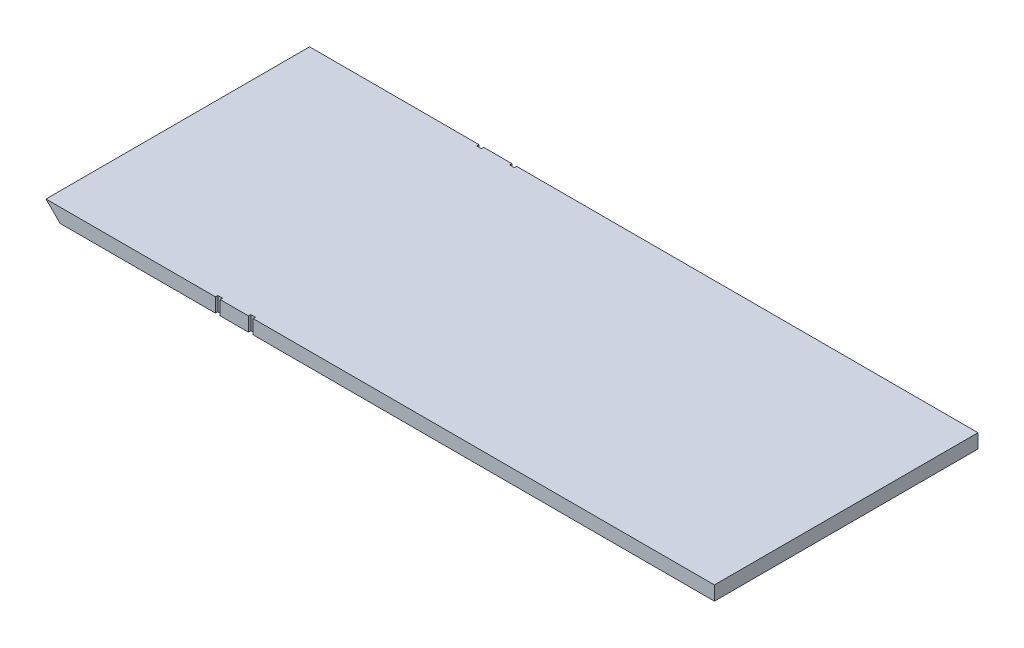
ISO-10303-21;
HEADER;
FILE_DESCRIPTION(('STEP AP214'),'2;1');
FILE_NAME('part.step','',(''),(''),'','','');
FILE_SCHEMA(('AUTOMOTIVE_DESIGN { 1 0 10303 214 1 1 1 1 }'));
ENDSEC;
DATA;
#1=APPLICATION_CONTEXT('core data for automotive mechanical design processes');
#2=APPLICATION_PROTOCOL_DEFINITION('international standard','automotive_design',2000,#1);
#3=PRODUCT_CONTEXT('',#1,'mechanical');
#4=PRODUCT('Part','Part','',(#3));
#5=PRODUCT_RELATED_PRODUCT_CATEGORY('part','',(#4));
#6=PRODUCT_DEFINITION_FORMATION('','',#4);
#7=PRODUCT_DEFINITION_CONTEXT('part definition',#1,'design');
#8=PRODUCT_DEFINITION('design','',#6,#7);
#9=PRODUCT_DEFINITION_SHAPE('','',#8);
#10=(LENGTH_UNIT() NAMED_UNIT(*) SI_UNIT(.MILLI.,.METRE.));
#11=(NAMED_UNIT(*) PLANE_ANGLE_UNIT() SI_UNIT($,.RADIAN.));
#12=(NAMED_UNIT(*) SI_UNIT($,.STERADIAN.) SOLID_ANGLE_UNIT());
#13=UNCERTAINTY_MEASURE_WITH_UNIT(LENGTH_MEASURE(1.E-05),#10,'distance_accuracy_value','');
#14=(GEOMETRIC_REPRESENTATION_CONTEXT(3) GLOBAL_UNCERTAINTY_ASSIGNED_CONTEXT((#13)) GLOBAL_UNIT_ASSIGNED_CONTEXT((#10,
#11,#12)) REPRESENTATION_CONTEXT('',''));
#15=CARTESIAN_POINT('',(0.,0.,0.));
#16=DIRECTION('',(0.,0.,1.));
#17=DIRECTION('',(1.,0.,0.));
#18=AXIS2_PLACEMENT_3D('',#15,#16,#17);
#19=CARTESIAN_POINT('',(-450.85,9.525,-177.8));
#20=DIRECTION('',(0.,0.,1.));
#21=DIRECTION('',(1.,0.,0.));
#22=AXIS2_PLACEMENT_3D('',#19,#20,#21);
#23=PLANE('',#22);
#24=DIRECTION('',(-1.,0.,0.));
#25=VECTOR('',#24,1.);
#26=CARTESIAN_POINT('',(-450.85,9.525,-177.8));
#27=LINE('',#26,#25);
#28=CARTESIAN_POINT('',(-222.249999999984,9.52499999998907,-177.8));
#29=VERTEX_POINT('',#28);
#30=CARTESIAN_POINT('',(-450.85,9.525,-177.8));
#31=VERTEX_POINT('',#30);
#32=EDGE_CURVE('E280',#29,#31,#27,.T.);
#33=ORIENTED_EDGE('',*,*,#32,.F.);
#34=DIRECTION('',(0.,1.,0.));
#35=VECTOR('',#34,1.);
#36=CARTESIAN_POINT('',(-222.249999999984,-9.525,-177.8));
#37=LINE('',#36,#35);
#38=CARTESIAN_POINT('',(-222.249999999984,-9.525,-177.8));
#39=VERTEX_POINT('',#38);
#40=EDGE_CURVE('E175',#39,#29,#37,.T.);
#41=ORIENTED_EDGE('',*,*,#40,.F.);
#42=DIRECTION('',(-1.,0.,0.));
#43=VECTOR('',#42,1.);
#44=CARTESIAN_POINT('',(-450.85,-9.525,-177.8));
#45=LINE('',#44,#43);
#46=CARTESIAN_POINT('',(-431.8,-9.525,-177.8));
#47=VERTEX_POINT('',#46);
#48=EDGE_CURVE('E297',#39,#47,#45,.T.);
#49=ORIENTED_EDGE('',*,*,#48,.T.);
#50=DIRECTION('',(0.70710678118655,-0.707106781186545,0.));
#51=VECTOR('',#50,1.);
#52=CARTESIAN_POINT('',(-450.85,9.52500000000012,-177.8));
#53=LINE('',#52,#51);
#54=EDGE_CURVE('E11',#47,#31,#53,.F.);
#55=ORIENTED_EDGE('',*,*,#54,.T.);
#56=EDGE_LOOP('',(#33,#41,#49,#55));
#57=FACE_BOUND('',#56,.T.);
#58=ADVANCED_FACE('F32',(#57),#23,.F.);
#59=CARTESIAN_POINT('',(-177.799999999984,-9.525,-177.8));
#60=VERTEX_POINT('',#59);
#61=CARTESIAN_POINT('',(-215.899999999984,-9.525,-177.8));
#62=VERTEX_POINT('',#61);
#63=EDGE_CURVE('E302',#60,#62,#45,.T.);
#64=ORIENTED_EDGE('',*,*,#63,.T.);
#65=DIRECTION('',(0.,-1.,0.));
#66=VECTOR('',#65,1.);
#67=CARTESIAN_POINT('',(-215.899999999984,-9.525,-177.8));
#68=LINE('',#67,#66);
#69=CARTESIAN_POINT('',(-215.899999999984,9.52499999998913,-177.8));
#70=VERTEX_POINT('',#69);
#71=EDGE_CURVE('E187',#70,#62,#68,.T.);
#72=ORIENTED_EDGE('',*,*,#71,.F.);
#73=CARTESIAN_POINT('',(-177.799999999984,9.52499999998935,-177.8));
#74=VERTEX_POINT('',#73);
#75=EDGE_CURVE('E286',#74,#70,#27,.T.);
#76=ORIENTED_EDGE('',*,*,#75,.F.);
#77=DIRECTION('',(0.,1.,0.));
#78=VECTOR('',#77,1.);
#79=CARTESIAN_POINT('',(-177.799999999984,9.52499999998935,-177.8));
#80=LINE('',#79,#78);
#81=EDGE_CURVE('E199',#60,#74,#80,.T.);
#82=ORIENTED_EDGE('',*,*,#81,.F.);
#83=EDGE_LOOP('',(#64,#72,#76,#82));
#84=FACE_BOUND('',#83,.T.);
#85=ADVANCED_FACE('F327',(#84),#23,.F.);
#86=CARTESIAN_POINT('',(-450.85,9.525,177.8));
#87=DIRECTION('',(0.,0.,-1.));
#88=DIRECTION('',(-1.,0.,0.));
#89=AXIS2_PLACEMENT_3D('',#86,#87,#88);
#90=PLANE('',#89);
#91=DIRECTION('',(1.,0.,0.));
#92=VECTOR('',#91,1.);
#93=CARTESIAN_POINT('',(-450.85,-9.525,177.8));
#94=LINE('',#93,#92);
#95=CARTESIAN_POINT('',(-431.8,-9.525,177.8));
#96=VERTEX_POINT('',#95);
#97=CARTESIAN_POINT('',(-222.25,-9.525,177.8));
#98=VERTEX_POINT('',#97);
#99=EDGE_CURVE('E281',#96,#98,#94,.T.);
#100=ORIENTED_EDGE('',*,*,#99,.T.);
#101=DIRECTION('',(0.,-1.,0.));
#102=VECTOR('',#101,1.);
#103=CARTESIAN_POINT('',(-222.25,9.52500000000428,177.8));
#104=LINE('',#103,#102);
#105=CARTESIAN_POINT('',(-222.25,9.52500000000428,177.8));
#106=VERTEX_POINT('',#105);
#107=EDGE_CURVE('E218',#106,#98,#104,.T.);
#108=ORIENTED_EDGE('',*,*,#107,.F.);
#109=DIRECTION('',(1.,0.,0.));
#110=VECTOR('',#109,1.);
#111=CARTESIAN_POINT('',(-450.85,9.525,177.8));
#112=LINE('',#111,#110);
#113=CARTESIAN_POINT('',(-450.85,9.525,177.8));
#114=VERTEX_POINT('',#113);
#115=EDGE_CURVE('E290',#114,#106,#112,.T.);
#116=ORIENTED_EDGE('',*,*,#115,.F.);
#117=DIRECTION('',(-0.70710678118655,0.707106781186545,0.));
#118=VECTOR('',#117,1.);
#119=CARTESIAN_POINT('',(-450.85,9.52500000000015,177.8));
#120=LINE('',#119,#118);
#121=EDGE_CURVE('E311',#114,#96,#120,.F.);
#122=ORIENTED_EDGE('',*,*,#121,.T.);
#123=EDGE_LOOP('',(#100,#108,#116,#122));
#124=FACE_BOUND('',#123,.T.);
#125=ADVANCED_FACE('F348',(#124),#90,.F.);
#126=CARTESIAN_POINT('',(-171.45,9.52500000000431,177.8));
#127=VERTEX_POINT('',#126);
#128=CARTESIAN_POINT('',(450.85,9.525,177.8));
#129=VERTEX_POINT('',#128);
#130=EDGE_CURVE('E289',#127,#129,#112,.T.);
#131=ORIENTED_EDGE('',*,*,#130,.F.);
#132=DIRECTION('',(0.,1.,0.));
#133=VECTOR('',#132,1.);
#134=CARTESIAN_POINT('',(-171.45,-9.525,177.8));
#135=LINE('',#134,#133);
#136=CARTESIAN_POINT('',(-171.45,-9.525,177.8));
#137=VERTEX_POINT('',#136);
#138=EDGE_CURVE('E255',#137,#127,#135,.T.);
#139=ORIENTED_EDGE('',*,*,#138,.F.);
#140=CARTESIAN_POINT('',(450.85,-9.525,177.8));
#141=VERTEX_POINT('',#140);
#142=EDGE_CURVE('E301',#137,#141,#94,.T.);
#143=ORIENTED_EDGE('',*,*,#142,.T.);
#144=DIRECTION('',(0.,-1.,0.));
#145=VECTOR('',#144,1.);
#146=CARTESIAN_POINT('',(450.85,9.525,177.8));
#147=LINE('',#146,#145);
#148=EDGE_CURVE('E293',#129,#141,#147,.T.);
#149=ORIENTED_EDGE('',*,*,#148,.F.);
#150=EDGE_LOOP('',(#131,#139,#143,#149));
#151=FACE_BOUND('',#150,.T.);
#152=ADVANCED_FACE('F359',(#151),#90,.F.);
#153=CARTESIAN_POINT('',(450.85,9.525,-177.8));
#154=DIRECTION('',(-1.,0.,0.));
#155=DIRECTION('',(0.,0.,1.));
#156=AXIS2_PLACEMENT_3D('',#153,#154,#155);
#157=PLANE('',#156);
#158=DIRECTION('',(0.,0.,-1.));
#159=VECTOR('',#158,1.);
#160=CARTESIAN_POINT('',(450.85,-9.525,-177.8));
#161=LINE('',#160,#159);
#162=CARTESIAN_POINT('',(450.85,-9.525,-177.8));
#163=VERTEX_POINT('',#162);
#164=EDGE_CURVE('E269',#141,#163,#161,.T.);
#165=ORIENTED_EDGE('',*,*,#164,.T.);
#166=DIRECTION('',(0.,-1.,0.));
#167=VECTOR('',#166,1.);
#168=CARTESIAN_POINT('',(450.85,9.525,-177.8));
#169=LINE('',#168,#167);
#170=CARTESIAN_POINT('',(450.85,9.525,-177.8));
#171=VERTEX_POINT('',#170);
#172=EDGE_CURVE('E308',#171,#163,#169,.T.);
#173=ORIENTED_EDGE('',*,*,#172,.F.);
#174=DIRECTION('',(0.,0.,-1.));
#175=VECTOR('',#174,1.);
#176=CARTESIAN_POINT('',(450.85,9.525,-177.8));
#177=LINE('',#176,#175);
#178=EDGE_CURVE('E277',#129,#171,#177,.T.);
#179=ORIENTED_EDGE('',*,*,#178,.F.);
#180=ORIENTED_EDGE('',*,*,#148,.T.);
#181=EDGE_LOOP('',(#165,#173,#179,#180));
#182=FACE_BOUND('',#181,.T.);
#183=ADVANCED_FACE('F352',(#182),#157,.F.);
#184=CARTESIAN_POINT('',(-171.449999999984,-9.525,-177.8));
#185=VERTEX_POINT('',#184);
#186=EDGE_CURVE('E298',#163,#185,#45,.T.);
#187=ORIENTED_EDGE('',*,*,#186,.T.);
#188=DIRECTION('',(0.,-1.,0.));
#189=VECTOR('',#188,1.);
#190=CARTESIAN_POINT('',(-171.449999999984,9.52499999998938,-177.8));
#191=LINE('',#190,#189);
#192=CARTESIAN_POINT('',(-171.449999999984,9.52499999998938,-177.8));
#193=VERTEX_POINT('',#192);
#194=EDGE_CURVE('E208',#193,#185,#191,.T.);
#195=ORIENTED_EDGE('',*,*,#194,.F.);
#196=EDGE_CURVE('E282',#171,#193,#27,.T.);
#197=ORIENTED_EDGE('',*,*,#196,.F.);
#198=ORIENTED_EDGE('',*,*,#172,.T.);
#199=EDGE_LOOP('',(#187,#195,#197,#198));
#200=FACE_BOUND('',#199,.T.);
#201=ADVANCED_FACE('F344',(#200),#23,.F.);
#202=CARTESIAN_POINT('',(-215.9,9.52500000000428,177.8));
#203=VERTEX_POINT('',#202);
#204=CARTESIAN_POINT('',(-177.8,9.52500000000431,177.8));
#205=VERTEX_POINT('',#204);
#206=EDGE_CURVE('E294',#203,#205,#112,.T.);
#207=ORIENTED_EDGE('',*,*,#206,.F.);
#208=DIRECTION('',(0.,1.,0.));
#209=VECTOR('',#208,1.);
#210=CARTESIAN_POINT('',(-215.9,9.52500000000428,177.8));
#211=LINE('',#210,#209);
#212=CARTESIAN_POINT('',(-215.9,-9.525,177.8));
#213=VERTEX_POINT('',#212);
#214=EDGE_CURVE('E229',#213,#203,#211,.T.);
#215=ORIENTED_EDGE('',*,*,#214,.F.);
#216=CARTESIAN_POINT('',(-177.8,-9.525,177.8));
#217=VERTEX_POINT('',#216);
#218=EDGE_CURVE('E305',#213,#217,#94,.T.);
#219=ORIENTED_EDGE('',*,*,#218,.T.);
#220=DIRECTION('',(0.,-1.,0.));
#221=VECTOR('',#220,1.);
#222=CARTESIAN_POINT('',(-177.8,-9.525,177.8));
#223=LINE('',#222,#221);
#224=EDGE_CURVE('E243',#205,#217,#223,.T.);
#225=ORIENTED_EDGE('',*,*,#224,.F.);
#226=EDGE_LOOP('',(#207,#215,#219,#225));
#227=FACE_BOUND('',#226,.T.);
#228=ADVANCED_FACE('F351',(#227),#90,.F.);
#229=CARTESIAN_POINT('',(0.,9.525,0.));
#230=DIRECTION('',(0.,1.,0.));
#231=DIRECTION('',(0.,0.,1.));
#232=AXIS2_PLACEMENT_3D('',#229,#230,#231);
#233=PLANE('',#232);
#234=DIRECTION('',(0.,0.,-1.));
#235=VECTOR('',#234,1.);
#236=CARTESIAN_POINT('',(-222.249999999984,9.52499999998907,-174.625));
#237=LINE('',#236,#235);
#238=CARTESIAN_POINT('',(-222.249999999984,9.52499999998907,-174.625));
#239=VERTEX_POINT('',#238);
#240=EDGE_CURVE('E170',#239,#29,#237,.T.);
#241=ORIENTED_EDGE('',*,*,#240,.T.);
#242=ORIENTED_EDGE('',*,*,#32,.T.);
#243=DIRECTION('',(0.,0.,1.));
#244=VECTOR('',#243,1.);
#245=CARTESIAN_POINT('',(-450.85,9.525,-177.8));
#246=LINE('',#245,#244);
#247=EDGE_CURVE('E285',#31,#114,#246,.T.);
#248=ORIENTED_EDGE('',*,*,#247,.T.);
#249=ORIENTED_EDGE('',*,*,#115,.T.);
#250=DIRECTION('',(0.,0.,1.));
#251=VECTOR('',#250,1.);
#252=CARTESIAN_POINT('',(-222.25,9.52500000000428,174.625));
#253=LINE('',#252,#251);
#254=CARTESIAN_POINT('',(-222.25,9.52500000000428,174.625));
#255=VERTEX_POINT('',#254);
#256=EDGE_CURVE('E241',#255,#106,#253,.T.);
#257=ORIENTED_EDGE('',*,*,#256,.F.);
#258=DIRECTION('',(-1.,0.,0.));
#259=VECTOR('',#258,1.);
#260=CARTESIAN_POINT('',(-222.25,9.52500000000428,174.625));
#261=LINE('',#260,#259);
#262=CARTESIAN_POINT('',(-215.9,9.52500000000428,174.625));
#263=VERTEX_POINT('',#262);
#264=EDGE_CURVE('E235',#263,#255,#261,.T.);
#265=ORIENTED_EDGE('',*,*,#264,.F.);
#266=DIRECTION('',(0.,0.,1.));
#267=VECTOR('',#266,1.);
#268=CARTESIAN_POINT('',(-215.9,9.52500000000428,174.625));
#269=LINE('',#268,#267);
#270=EDGE_CURVE('E244',#263,#203,#269,.T.);
#271=ORIENTED_EDGE('',*,*,#270,.T.);
#272=ORIENTED_EDGE('',*,*,#206,.T.);
#273=DIRECTION('',(0.,0.,1.));
#274=VECTOR('',#273,1.);
#275=CARTESIAN_POINT('',(-177.8,9.52500000000431,174.625));
#276=LINE('',#275,#274);
#277=CARTESIAN_POINT('',(-177.8,9.52500000000431,174.625));
#278=VERTEX_POINT('',#277);
#279=EDGE_CURVE('E262',#278,#205,#276,.T.);
#280=ORIENTED_EDGE('',*,*,#279,.F.);
#281=DIRECTION('',(-1.,0.,0.));
#282=VECTOR('',#281,1.);
#283=CARTESIAN_POINT('',(-177.8,9.52500000000431,174.625));
#284=LINE('',#283,#282);
#285=CARTESIAN_POINT('',(-171.45,9.52500000000431,174.625));
#286=VERTEX_POINT('',#285);
#287=EDGE_CURVE('E251',#286,#278,#284,.T.);
#288=ORIENTED_EDGE('',*,*,#287,.F.);
#289=DIRECTION('',(0.,0.,1.));
#290=VECTOR('',#289,1.);
#291=CARTESIAN_POINT('',(-171.45,9.52500000000431,174.625));
#292=LINE('',#291,#290);
#293=EDGE_CURVE('E266',#286,#127,#292,.T.);
#294=ORIENTED_EDGE('',*,*,#293,.T.);
#295=ORIENTED_EDGE('',*,*,#130,.T.);
#296=ORIENTED_EDGE('',*,*,#178,.T.);
#297=ORIENTED_EDGE('',*,*,#196,.T.);
#298=DIRECTION('',(0.,0.,-1.));
#299=VECTOR('',#298,1.);
#300=CARTESIAN_POINT('',(-171.449999999984,9.52499999998938,-174.625));
#301=LINE('',#300,#299);
#302=CARTESIAN_POINT('',(-171.449999999984,9.52499999998938,-174.625));
#303=VERTEX_POINT('',#302);
#304=EDGE_CURVE('E222',#303,#193,#301,.T.);
#305=ORIENTED_EDGE('',*,*,#304,.F.);
#306=DIRECTION('',(1.,0.,0.));
#307=VECTOR('',#306,1.);
#308=CARTESIAN_POINT('',(-177.799999999984,9.52499999998935,-174.625));
#309=LINE('',#308,#307);
#310=CARTESIAN_POINT('',(-177.799999999984,9.52499999998935,-174.625));
#311=VERTEX_POINT('',#310);
#312=EDGE_CURVE('E207',#311,#303,#309,.T.);
#313=ORIENTED_EDGE('',*,*,#312,.F.);
#314=DIRECTION('',(0.,0.,-1.));
#315=VECTOR('',#314,1.);
#316=CARTESIAN_POINT('',(-177.799999999984,9.52499999998935,-174.625));
#317=LINE('',#316,#315);
#318=EDGE_CURVE('E213',#311,#74,#317,.T.);
#319=ORIENTED_EDGE('',*,*,#318,.T.);
#320=ORIENTED_EDGE('',*,*,#75,.T.);
#321=DIRECTION('',(0.,0.,-1.));
#322=VECTOR('',#321,1.);
#323=CARTESIAN_POINT('',(-215.899999999984,9.52499999998913,-174.625));
#324=LINE('',#323,#322);
#325=CARTESIAN_POINT('',(-215.899999999984,9.52499999998913,-174.625));
#326=VERTEX_POINT('',#325);
#327=EDGE_CURVE('E179',#326,#70,#324,.T.);
#328=ORIENTED_EDGE('',*,*,#327,.F.);
#329=DIRECTION('',(1.,0.,0.));
#330=VECTOR('',#329,1.);
#331=CARTESIAN_POINT('',(-222.249999999984,9.52499999998907,-174.625));
#332=LINE('',#331,#330);
#333=EDGE_CURVE('E183',#239,#326,#332,.T.);
#334=ORIENTED_EDGE('',*,*,#333,.F.);
#335=EDGE_LOOP('',(#241,#242,#248,#249,#257,#265,#271,#272,#280,#288,#294,#295,#296,#297,#305,
#313,#319,#320,#328,#334));
#336=FACE_BOUND('',#335,.T.);
#337=ADVANCED_FACE('F189',(#336),#233,.T.);
#338=CARTESIAN_POINT('',(0.,-9.525,0.));
#339=DIRECTION('',(0.,1.,0.));
#340=DIRECTION('',(0.,0.,1.));
#341=AXIS2_PLACEMENT_3D('',#338,#339,#340);
#342=PLANE('',#341);
#343=ORIENTED_EDGE('',*,*,#48,.F.);
#344=DIRECTION('',(0.,0.,-1.));
#345=VECTOR('',#344,1.);
#346=CARTESIAN_POINT('',(-222.249999999984,-9.525,-174.625));
#347=LINE('',#346,#345);
#348=CARTESIAN_POINT('',(-222.249999999984,-9.525,-174.625));
#349=VERTEX_POINT('',#348);
#350=EDGE_CURVE('E197',#349,#39,#347,.T.);
#351=ORIENTED_EDGE('',*,*,#350,.F.);
#352=DIRECTION('',(-1.,0.,0.));
#353=VECTOR('',#352,1.);
#354=CARTESIAN_POINT('',(-222.249999999984,-9.525,-174.625));
#355=LINE('',#354,#353);
#356=CARTESIAN_POINT('',(-215.899999999984,-9.525,-174.625));
#357=VERTEX_POINT('',#356);
#358=EDGE_CURVE('E180',#357,#349,#355,.T.);
#359=ORIENTED_EDGE('',*,*,#358,.F.);
#360=DIRECTION('',(0.,0.,-1.));
#361=VECTOR('',#360,1.);
#362=CARTESIAN_POINT('',(-215.899999999984,-9.525,-174.625));
#363=LINE('',#362,#361);
#364=EDGE_CURVE('E200',#357,#62,#363,.T.);
#365=ORIENTED_EDGE('',*,*,#364,.T.);
#366=ORIENTED_EDGE('',*,*,#63,.F.);
#367=DIRECTION('',(0.,0.,-1.));
#368=VECTOR('',#367,1.);
#369=CARTESIAN_POINT('',(-177.799999999984,-9.525,-174.625));
#370=LINE('',#369,#368);
#371=CARTESIAN_POINT('',(-177.799999999984,-9.525,-174.625));
#372=VERTEX_POINT('',#371);
#373=EDGE_CURVE('E216',#372,#60,#370,.T.);
#374=ORIENTED_EDGE('',*,*,#373,.F.);
#375=DIRECTION('',(-1.,0.,0.));
#376=VECTOR('',#375,1.);
#377=CARTESIAN_POINT('',(-177.799999999984,-9.525,-174.625));
#378=LINE('',#377,#376);
#379=CARTESIAN_POINT('',(-171.449999999984,-9.525,-174.625));
#380=VERTEX_POINT('',#379);
#381=EDGE_CURVE('E211',#380,#372,#378,.T.);
#382=ORIENTED_EDGE('',*,*,#381,.F.);
#383=DIRECTION('',(0.,0.,-1.));
#384=VECTOR('',#383,1.);
#385=CARTESIAN_POINT('',(-171.449999999984,-9.525,-174.625));
#386=LINE('',#385,#384);
#387=EDGE_CURVE('E219',#380,#185,#386,.T.);
#388=ORIENTED_EDGE('',*,*,#387,.T.);
#389=ORIENTED_EDGE('',*,*,#186,.F.);
#390=ORIENTED_EDGE('',*,*,#164,.F.);
#391=ORIENTED_EDGE('',*,*,#142,.F.);
#392=DIRECTION('',(0.,0.,1.));
#393=VECTOR('',#392,1.);
#394=CARTESIAN_POINT('',(-171.45,-9.525,174.625));
#395=LINE('',#394,#393);
#396=CARTESIAN_POINT('',(-171.45,-9.525,174.625));
#397=VERTEX_POINT('',#396);
#398=EDGE_CURVE('E270',#397,#137,#395,.T.);
#399=ORIENTED_EDGE('',*,*,#398,.F.);
#400=DIRECTION('',(1.,0.,0.));
#401=VECTOR('',#400,1.);
#402=CARTESIAN_POINT('',(-177.8,-9.525,174.625));
#403=LINE('',#402,#401);
#404=CARTESIAN_POINT('',(-177.8,-9.525,174.625));
#405=VERTEX_POINT('',#404);
#406=EDGE_CURVE('E257',#405,#397,#403,.T.);
#407=ORIENTED_EDGE('',*,*,#406,.F.);
#408=DIRECTION('',(0.,0.,1.));
#409=VECTOR('',#408,1.);
#410=CARTESIAN_POINT('',(-177.8,-9.525,174.625));
#411=LINE('',#410,#409);
#412=EDGE_CURVE('E272',#405,#217,#411,.T.);
#413=ORIENTED_EDGE('',*,*,#412,.T.);
#414=ORIENTED_EDGE('',*,*,#218,.F.);
#415=DIRECTION('',(0.,0.,1.));
#416=VECTOR('',#415,1.);
#417=CARTESIAN_POINT('',(-215.9,-9.525,174.625));
#418=LINE('',#417,#416);
#419=CARTESIAN_POINT('',(-215.9,-9.525,174.625));
#420=VERTEX_POINT('',#419);
#421=EDGE_CURVE('E247',#420,#213,#418,.T.);
#422=ORIENTED_EDGE('',*,*,#421,.F.);
#423=DIRECTION('',(1.,0.,0.));
#424=VECTOR('',#423,1.);
#425=CARTESIAN_POINT('',(-222.25,-9.525,174.625));
#426=LINE('',#425,#424);
#427=CARTESIAN_POINT('',(-222.25,-9.525,174.625));
#428=VERTEX_POINT('',#427);
#429=EDGE_CURVE('E228',#428,#420,#426,.T.);
#430=ORIENTED_EDGE('',*,*,#429,.F.);
#431=DIRECTION('',(0.,0.,1.));
#432=VECTOR('',#431,1.);
#433=CARTESIAN_POINT('',(-222.25,-9.525,174.625));
#434=LINE('',#433,#432);
#435=EDGE_CURVE('E238',#428,#98,#434,.T.);
#436=ORIENTED_EDGE('',*,*,#435,.T.);
#437=ORIENTED_EDGE('',*,*,#99,.F.);
#438=DIRECTION('',(0.,0.,-1.));
#439=VECTOR('',#438,1.);
#440=CARTESIAN_POINT('',(-431.8,-9.525,0.));
#441=LINE('',#440,#439);
#442=EDGE_CURVE('E40',#96,#47,#441,.T.);
#443=ORIENTED_EDGE('',*,*,#442,.T.);
#444=EDGE_LOOP('',(#343,#351,#359,#365,#366,#374,#382,#388,#389,#390,#391,#399,#407,#413,#414,
#422,#430,#436,#437,#443));
#445=FACE_BOUND('',#444,.T.);
#446=ADVANCED_FACE('F318',(#445),#342,.F.);
#447=CARTESIAN_POINT('',(-450.85,9.52500000000012,-177.8));
#448=DIRECTION('',(0.707106781186545,0.70710678118655,0.));
#449=DIRECTION('',(0.,0.,1.));
#450=AXIS2_PLACEMENT_3D('',#447,#448,#449);
#451=PLANE('',#450);
#452=ORIENTED_EDGE('',*,*,#54,.F.);
#453=ORIENTED_EDGE('',*,*,#442,.F.);
#454=ORIENTED_EDGE('',*,*,#121,.F.);
#455=ORIENTED_EDGE('',*,*,#247,.F.);
#456=EDGE_LOOP('',(#452,#453,#454,#455));
#457=FACE_BOUND('',#456,.T.);
#458=ADVANCED_FACE('F34',(#457),#451,.F.);
#459=CARTESIAN_POINT('',(-171.45,-9.525,174.625));
#460=DIRECTION('',(1.,0.,0.));
#461=DIRECTION('',(0.,1.,0.));
#462=AXIS2_PLACEMENT_3D('',#459,#460,#461);
#463=PLANE('',#462);
#464=ORIENTED_EDGE('',*,*,#138,.T.);
#465=ORIENTED_EDGE('',*,*,#293,.F.);
#466=DIRECTION('',(0.,1.,0.));
#467=VECTOR('',#466,1.);
#468=CARTESIAN_POINT('',(-171.45,-9.525,174.625));
#469=LINE('',#468,#467);
#470=EDGE_CURVE('E259',#397,#286,#469,.T.);
#471=ORIENTED_EDGE('',*,*,#470,.F.);
#472=ORIENTED_EDGE('',*,*,#398,.T.);
#473=EDGE_LOOP('',(#464,#465,#471,#472));
#474=FACE_BOUND('',#473,.T.);
#475=ADVANCED_FACE('F390',(#474),#463,.F.);
#476=CARTESIAN_POINT('',(-177.8,-9.525,174.625));
#477=DIRECTION('',(-1.,0.,0.));
#478=DIRECTION('',(0.,0.,1.));
#479=AXIS2_PLACEMENT_3D('',#476,#477,#478);
#480=PLANE('',#479);
#481=ORIENTED_EDGE('',*,*,#224,.T.);
#482=ORIENTED_EDGE('',*,*,#412,.F.);
#483=DIRECTION('',(0.,-1.,0.));
#484=VECTOR('',#483,1.);
#485=CARTESIAN_POINT('',(-177.8,-9.525,174.625));
#486=LINE('',#485,#484);
#487=EDGE_CURVE('E254',#278,#405,#486,.T.);
#488=ORIENTED_EDGE('',*,*,#487,.F.);
#489=ORIENTED_EDGE('',*,*,#279,.T.);
#490=EDGE_LOOP('',(#481,#482,#488,#489));
#491=FACE_BOUND('',#490,.T.);
#492=ADVANCED_FACE('F382',(#491),#480,.F.);
#493=CARTESIAN_POINT('',(0.,0.,174.625));
#494=DIRECTION('',(0.,0.,1.));
#495=DIRECTION('',(1.,0.,0.));
#496=AXIS2_PLACEMENT_3D('',#493,#494,#495);
#497=PLANE('',#496);
#498=ORIENTED_EDGE('',*,*,#287,.T.);
#499=ORIENTED_EDGE('',*,*,#487,.T.);
#500=ORIENTED_EDGE('',*,*,#406,.T.);
#501=ORIENTED_EDGE('',*,*,#470,.T.);
#502=EDGE_LOOP('',(#498,#499,#500,#501));
#503=FACE_BOUND('',#502,.T.);
#504=ADVANCED_FACE('F387',(#503),#497,.T.);
#505=CARTESIAN_POINT('',(-222.25,9.52500000000428,174.625));
#506=DIRECTION('',(-1.,0.,0.));
#507=DIRECTION('',(0.,0.,1.));
#508=AXIS2_PLACEMENT_3D('',#505,#506,#507);
#509=PLANE('',#508);
#510=ORIENTED_EDGE('',*,*,#107,.T.);
#511=ORIENTED_EDGE('',*,*,#435,.F.);
#512=DIRECTION('',(0.,-1.,0.));
#513=VECTOR('',#512,1.);
#514=CARTESIAN_POINT('',(-222.25,9.52500000000428,174.625));
#515=LINE('',#514,#513);
#516=EDGE_CURVE('E226',#255,#428,#515,.T.);
#517=ORIENTED_EDGE('',*,*,#516,.F.);
#518=ORIENTED_EDGE('',*,*,#256,.T.);
#519=EDGE_LOOP('',(#510,#511,#517,#518));
#520=FACE_BOUND('',#519,.T.);
#521=ADVANCED_FACE('F418',(#520),#509,.F.);
#522=CARTESIAN_POINT('',(-215.9,9.52500000000428,174.625));
#523=DIRECTION('',(1.,0.,0.));
#524=DIRECTION('',(0.,0.,-1.));
#525=AXIS2_PLACEMENT_3D('',#522,#523,#524);
#526=PLANE('',#525);
#527=ORIENTED_EDGE('',*,*,#214,.T.);
#528=ORIENTED_EDGE('',*,*,#270,.F.);
#529=DIRECTION('',(0.,1.,0.));
#530=VECTOR('',#529,1.);
#531=CARTESIAN_POINT('',(-215.9,9.52500000000428,174.625));
#532=LINE('',#531,#530);
#533=EDGE_CURVE('E232',#420,#263,#532,.T.);
#534=ORIENTED_EDGE('',*,*,#533,.F.);
#535=ORIENTED_EDGE('',*,*,#421,.T.);
#536=EDGE_LOOP('',(#527,#528,#534,#535));
#537=FACE_BOUND('',#536,.T.);
#538=ADVANCED_FACE('F394',(#537),#526,.F.);
#539=CARTESIAN_POINT('',(0.,0.,174.625));
#540=DIRECTION('',(0.,0.,1.));
#541=DIRECTION('',(1.,0.,0.));
#542=AXIS2_PLACEMENT_3D('',#539,#540,#541);
#543=PLANE('',#542);
#544=ORIENTED_EDGE('',*,*,#516,.T.);
#545=ORIENTED_EDGE('',*,*,#429,.T.);
#546=ORIENTED_EDGE('',*,*,#533,.T.);
#547=ORIENTED_EDGE('',*,*,#264,.T.);
#548=EDGE_LOOP('',(#544,#545,#546,#547));
#549=FACE_BOUND('',#548,.T.);
#550=ADVANCED_FACE('F396',(#549),#543,.T.);
#551=CARTESIAN_POINT('',(-177.799999999984,9.52499999998935,-174.625));
#552=DIRECTION('',(-1.,0.,0.));
#553=DIRECTION('',(0.,-1.,0.));
#554=AXIS2_PLACEMENT_3D('',#551,#552,#553);
#555=PLANE('',#554);
#556=ORIENTED_EDGE('',*,*,#81,.T.);
#557=ORIENTED_EDGE('',*,*,#318,.F.);
#558=DIRECTION('',(0.,1.,0.));
#559=VECTOR('',#558,1.);
#560=CARTESIAN_POINT('',(-177.799999999984,9.52499999998935,-174.625));
#561=LINE('',#560,#559);
#562=EDGE_CURVE('E204',#372,#311,#561,.T.);
#563=ORIENTED_EDGE('',*,*,#562,.F.);
#564=ORIENTED_EDGE('',*,*,#373,.T.);
#565=EDGE_LOOP('',(#556,#557,#563,#564));
#566=FACE_BOUND('',#565,.T.);
#567=ADVANCED_FACE('F404',(#566),#555,.F.);
#568=CARTESIAN_POINT('',(-171.449999999984,9.52499999998938,-174.625));
#569=DIRECTION('',(1.,0.,0.));
#570=DIRECTION('',(0.,1.,0.));
#571=AXIS2_PLACEMENT_3D('',#568,#569,#570);
#572=PLANE('',#571);
#573=ORIENTED_EDGE('',*,*,#194,.T.);
#574=ORIENTED_EDGE('',*,*,#387,.F.);
#575=DIRECTION('',(0.,-1.,0.));
#576=VECTOR('',#575,1.);
#577=CARTESIAN_POINT('',(-171.449999999984,9.52499999998938,-174.625));
#578=LINE('',#577,#576);
#579=EDGE_CURVE('E55',#303,#380,#578,.T.);
#580=ORIENTED_EDGE('',*,*,#579,.F.);
#581=ORIENTED_EDGE('',*,*,#304,.T.);
#582=EDGE_LOOP('',(#573,#574,#580,#581));
#583=FACE_BOUND('',#582,.T.);
#584=ADVANCED_FACE('F366',(#583),#572,.F.);
#585=CARTESIAN_POINT('',(0.,0.,-174.625));
#586=DIRECTION('',(0.,0.,1.));
#587=DIRECTION('',(1.,0.,0.));
#588=AXIS2_PLACEMENT_3D('',#585,#586,#587);
#589=PLANE('',#588);
#590=ORIENTED_EDGE('',*,*,#562,.T.);
#591=ORIENTED_EDGE('',*,*,#312,.T.);
#592=ORIENTED_EDGE('',*,*,#579,.T.);
#593=ORIENTED_EDGE('',*,*,#381,.T.);
#594=EDGE_LOOP('',(#590,#591,#592,#593));
#595=FACE_BOUND('',#594,.T.);
#596=ADVANCED_FACE('F340',(#595),#589,.F.);
#597=CARTESIAN_POINT('',(-222.249999999984,-9.525,-174.625));
#598=DIRECTION('',(-1.,0.,0.));
#599=DIRECTION('',(0.,-1.,0.));
#600=AXIS2_PLACEMENT_3D('',#597,#598,#599);
#601=PLANE('',#600);
#602=ORIENTED_EDGE('',*,*,#40,.T.);
#603=ORIENTED_EDGE('',*,*,#240,.F.);
#604=DIRECTION('',(0.,1.,0.));
#605=VECTOR('',#604,1.);
#606=CARTESIAN_POINT('',(-222.249999999984,-9.525,-174.625));
#607=LINE('',#606,#605);
#608=EDGE_CURVE('E173',#349,#239,#607,.T.);
#609=ORIENTED_EDGE('',*,*,#608,.F.);
#610=ORIENTED_EDGE('',*,*,#350,.T.);
#611=EDGE_LOOP('',(#602,#603,#609,#610));
#612=FACE_BOUND('',#611,.T.);
#613=ADVANCED_FACE('F172',(#612),#601,.F.);
#614=CARTESIAN_POINT('',(-215.899999999984,-9.525,-174.625));
#615=DIRECTION('',(1.,0.,0.));
#616=DIRECTION('',(0.,1.,0.));
#617=AXIS2_PLACEMENT_3D('',#614,#615,#616);
#618=PLANE('',#617);
#619=ORIENTED_EDGE('',*,*,#71,.T.);
#620=ORIENTED_EDGE('',*,*,#364,.F.);
#621=DIRECTION('',(0.,-1.,0.));
#622=VECTOR('',#621,1.);
#623=CARTESIAN_POINT('',(-215.899999999984,-9.525,-174.625));
#624=LINE('',#623,#622);
#625=EDGE_CURVE('E47',#326,#357,#624,.T.);
#626=ORIENTED_EDGE('',*,*,#625,.F.);
#627=ORIENTED_EDGE('',*,*,#327,.T.);
#628=EDGE_LOOP('',(#619,#620,#626,#627));
#629=FACE_BOUND('',#628,.T.);
#630=ADVANCED_FACE('F332',(#629),#618,.F.);
#631=CARTESIAN_POINT('',(0.,0.,-174.625));
#632=DIRECTION('',(0.,0.,-1.));
#633=DIRECTION('',(-1.,0.,0.));
#634=AXIS2_PLACEMENT_3D('',#631,#632,#633);
#635=PLANE('',#634);
#636=ORIENTED_EDGE('',*,*,#608,.T.);
#637=ORIENTED_EDGE('',*,*,#333,.T.);
#638=ORIENTED_EDGE('',*,*,#625,.T.);
#639=ORIENTED_EDGE('',*,*,#358,.T.);
#640=EDGE_LOOP('',(#636,#637,#638,#639));
#641=FACE_BOUND('',#640,.T.);
#642=ADVANCED_FACE('F182',(#641),#635,.T.);
#643=CLOSED_SHELL('',(#58,#85,#125,#152,#183,#201,#228,#337,#446,#458,#475,#492,#504,#521,#538,
#550,#567,#584,#596,#613,#630,#642));
#644=MANIFOLD_SOLID_BREP('B2',#643);
#645=ADVANCED_BREP_SHAPE_REPRESENTATION('',(#18,#644),#14);
#646=SHAPE_DEFINITION_REPRESENTATION(#9,#645);
ENDSEC;
END-ISO-10303-21;
